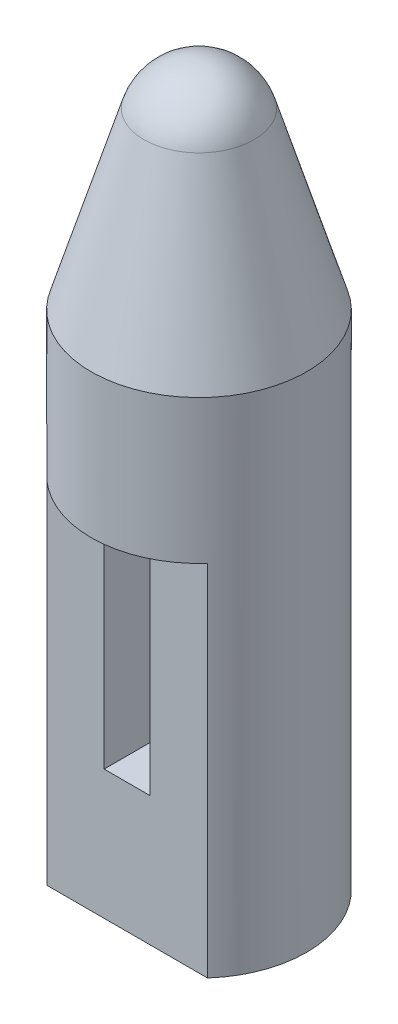
ISO-10303-21;
HEADER;
FILE_DESCRIPTION(('STEP AP214'),'2;1');
FILE_NAME('part.step','',(''),(''),'','','');
FILE_SCHEMA(('AUTOMOTIVE_DESIGN { 1 0 10303 214 1 1 1 1 }'));
ENDSEC;
DATA;
#1=APPLICATION_CONTEXT('core data for automotive mechanical design processes');
#2=APPLICATION_PROTOCOL_DEFINITION('international standard','automotive_design',2000,#1);
#3=PRODUCT_CONTEXT('',#1,'mechanical');
#4=PRODUCT('Part','Part','',(#3));
#5=PRODUCT_RELATED_PRODUCT_CATEGORY('part','',(#4));
#6=PRODUCT_DEFINITION_FORMATION('','',#4);
#7=PRODUCT_DEFINITION_CONTEXT('part definition',#1,'design');
#8=PRODUCT_DEFINITION('design','',#6,#7);
#9=PRODUCT_DEFINITION_SHAPE('','',#8);
#10=(LENGTH_UNIT() NAMED_UNIT(*) SI_UNIT(.MILLI.,.METRE.));
#11=(NAMED_UNIT(*) PLANE_ANGLE_UNIT() SI_UNIT($,.RADIAN.));
#12=(NAMED_UNIT(*) SI_UNIT($,.STERADIAN.) SOLID_ANGLE_UNIT());
#13=UNCERTAINTY_MEASURE_WITH_UNIT(LENGTH_MEASURE(1.E-05),#10,'distance_accuracy_value','');
#14=(GEOMETRIC_REPRESENTATION_CONTEXT(3) GLOBAL_UNCERTAINTY_ASSIGNED_CONTEXT((#13)) GLOBAL_UNIT_ASSIGNED_CONTEXT((#10,
#11,#12)) REPRESENTATION_CONTEXT('',''));
#15=CARTESIAN_POINT('',(0.,0.,0.));
#16=DIRECTION('',(0.,0.,1.));
#17=DIRECTION('',(1.,0.,0.));
#18=AXIS2_PLACEMENT_3D('',#15,#16,#17);
#19=CARTESIAN_POINT('',(0.,0.,1.));
#20=DIRECTION('',(0.,0.,-1.));
#21=DIRECTION('',(-1.,0.,0.));
#22=AXIS2_PLACEMENT_3D('',#19,#20,#21);
#23=PLANE('',#22);
#24=CARTESIAN_POINT('',(-16.3402501077831,13.5405133791338,1.));
#25=DIRECTION('',(0.,0.,1.));
#26=DIRECTION('',(1.,0.,0.));
#27=AXIS2_PLACEMENT_3D('',#24,#25,#26);
#28=CIRCLE('',#27,1.6);
#29=CARTESIAN_POINT('',(-14.7402501077831,13.5405133791338,1.));
#30=VERTEX_POINT('',#29);
#31=CARTESIAN_POINT('',(-17.9402501077831,13.5405133791338,1.));
#32=VERTEX_POINT('',#31);
#33=EDGE_CURVE('E49',#30,#32,#28,.T.);
#34=ORIENTED_EDGE('',*,*,#33,.F.);
#35=DIRECTION('',(0.,1.,0.));
#36=VECTOR('',#35,1.);
#37=CARTESIAN_POINT('',(-14.7402501077831,22.5405133791338,1.));
#38=LINE('',#37,#36);
#39=CARTESIAN_POINT('',(-14.7402501077831,22.5405133791338,1.));
#40=VERTEX_POINT('',#39);
#41=EDGE_CURVE('E115',#30,#40,#38,.T.);
#42=ORIENTED_EDGE('',*,*,#41,.T.);
#43=DIRECTION('',(-1.,0.,0.));
#44=VECTOR('',#43,1.);
#45=CARTESIAN_POINT('',(-14.7402501077831,22.5405133791338,1.));
#46=LINE('',#45,#44);
#47=CARTESIAN_POINT('',(-17.9402501077831,22.5405133791338,1.));
#48=VERTEX_POINT('',#47);
#49=EDGE_CURVE('E128',#40,#48,#46,.T.);
#50=ORIENTED_EDGE('',*,*,#49,.T.);
#51=DIRECTION('',(0.,-1.,0.));
#52=VECTOR('',#51,1.);
#53=CARTESIAN_POINT('',(-17.9402501077831,22.5405133791338,1.));
#54=LINE('',#53,#52);
#55=EDGE_CURVE('E117',#48,#32,#54,.T.);
#56=ORIENTED_EDGE('',*,*,#55,.T.);
#57=EDGE_LOOP('',(#34,#42,#50,#56));
#58=FACE_BOUND('',#57,.T.);
#59=ADVANCED_FACE('F34',(#58),#23,.F.);
#60=CARTESIAN_POINT('',(-16.3402501077831,43.5405133791338,0.));
#61=DIRECTION('',(0.,1.,0.));
#62=DIRECTION('',(1.,0.,0.));
#63=AXIS2_PLACEMENT_3D('',#60,#61,#62);
#64=SPHERICAL_SURFACE('',#63,4.);
#65=CARTESIAN_POINT('',(-16.3402501077831,44.6968053564314,0.));
#66=DIRECTION('',(0.,1.,0.));
#67=DIRECTION('',(-1.,0.,0.));
#68=AXIS2_PLACEMENT_3D('',#65,#66,#67);
#69=CIRCLE('',#68,3.82922823336989);
#70=CARTESIAN_POINT('',(-20.169478341153,44.6968053564314,0.));
#71=VERTEX_POINT('',#70);
#72=EDGE_CURVE('E171',#71,#71,#69,.T.);
#73=ORIENTED_EDGE('',*,*,#72,.T.);
#74=EDGE_LOOP('',(#73));
#75=FACE_BOUND('',#74,.T.);
#76=ADVANCED_FACE('F36',(#75),#64,.T.);
#77=CARTESIAN_POINT('',(-16.3402501077831,-2.45948662086624,0.));
#78=DIRECTION('',(0.,1.,0.));
#79=DIRECTION('',(-1.,0.,0.));
#80=AXIS2_PLACEMENT_3D('',#77,#78,#79);
#81=PLANE('',#80);
#82=CARTESIAN_POINT('',(-16.3402501077831,-2.45948662086624,0.));
#83=DIRECTION('',(0.,1.,0.));
#84=DIRECTION('',(-1.,0.,0.));
#85=AXIS2_PLACEMENT_3D('',#82,#83,#84);
#86=CIRCLE('',#85,7.5);
#87=CARTESIAN_POINT('',(-10.7500801640336,-2.45948662086624,5.));
#88=VERTEX_POINT('',#87);
#89=CARTESIAN_POINT('',(-10.7500801640336,-2.45948662086624,-5.));
#90=VERTEX_POINT('',#89);
#91=EDGE_CURVE('E43',#88,#90,#86,.T.);
#92=ORIENTED_EDGE('',*,*,#91,.F.);
#93=DIRECTION('',(1.,0.,0.));
#94=VECTOR('',#93,1.);
#95=CARTESIAN_POINT('',(-21.9304200515326,-2.45948662086624,5.));
#96=LINE('',#95,#94);
#97=CARTESIAN_POINT('',(-21.9304200515326,-2.45948662086624,5.));
#98=VERTEX_POINT('',#97);
#99=EDGE_CURVE('E144',#98,#88,#96,.T.);
#100=ORIENTED_EDGE('',*,*,#99,.F.);
#101=CARTESIAN_POINT('',(-21.9304200515326,-2.45948662086624,-5.));
#102=VERTEX_POINT('',#101);
#103=EDGE_CURVE('E11',#102,#98,#86,.T.);
#104=ORIENTED_EDGE('',*,*,#103,.F.);
#105=DIRECTION('',(-1.,0.,0.));
#106=VECTOR('',#105,1.);
#107=CARTESIAN_POINT('',(-21.9304200515326,-2.45948662086624,-5.));
#108=LINE('',#107,#106);
#109=EDGE_CURVE('E160',#90,#102,#108,.T.);
#110=ORIENTED_EDGE('',*,*,#109,.F.);
#111=EDGE_LOOP('',(#92,#100,#104,#110));
#112=FACE_BOUND('',#111,.T.);
#113=ADVANCED_FACE('F196',(#112),#81,.F.);
#114=CARTESIAN_POINT('',(-16.3402501077831,47.5405133791338,0.));
#115=DIRECTION('',(0.,1.,0.));
#116=DIRECTION('',(-1.,0.,0.));
#117=AXIS2_PLACEMENT_3D('',#114,#115,#116);
#118=CYLINDRICAL_SURFACE('',#117,7.5);
#119=ORIENTED_EDGE('',*,*,#103,.T.);
#120=DIRECTION('',(0.,-1.,0.));
#121=VECTOR('',#120,1.);
#122=CARTESIAN_POINT('',(-21.9304200515326,22.5405133791338,5.));
#123=LINE('',#122,#121);
#124=CARTESIAN_POINT('',(-21.9304200515326,22.5405133791338,5.));
#125=VERTEX_POINT('',#124);
#126=EDGE_CURVE('E155',#125,#98,#123,.T.);
#127=ORIENTED_EDGE('',*,*,#126,.F.);
#128=CARTESIAN_POINT('',(-16.3402501077831,22.5405133791338,0.));
#129=DIRECTION('',(0.,-1.,0.));
#130=DIRECTION('',(1.,0.,0.));
#131=AXIS2_PLACEMENT_3D('',#128,#129,#130);
#132=CIRCLE('',#131,7.5);
#133=CARTESIAN_POINT('',(-10.7500801640336,22.5405133791338,5.));
#134=VERTEX_POINT('',#133);
#135=EDGE_CURVE('E149',#134,#125,#132,.T.);
#136=ORIENTED_EDGE('',*,*,#135,.F.);
#137=DIRECTION('',(0.,-1.,0.));
#138=VECTOR('',#137,1.);
#139=CARTESIAN_POINT('',(-10.7500801640336,22.5405133791338,5.));
#140=LINE('',#139,#138);
#141=EDGE_CURVE('E157',#134,#88,#140,.T.);
#142=ORIENTED_EDGE('',*,*,#141,.T.);
#143=ORIENTED_EDGE('',*,*,#91,.T.);
#144=DIRECTION('',(0.,-1.,0.));
#145=VECTOR('',#144,1.);
#146=CARTESIAN_POINT('',(-10.7500801640336,22.5405133791338,-5.));
#147=LINE('',#146,#145);
#148=CARTESIAN_POINT('',(-10.7500801640336,22.5405133791338,-5.));
#149=VERTEX_POINT('',#148);
#150=EDGE_CURVE('E166',#149,#90,#147,.T.);
#151=ORIENTED_EDGE('',*,*,#150,.F.);
#152=CARTESIAN_POINT('',(-16.3402501077831,22.5405133791338,0.));
#153=DIRECTION('',(0.,-1.,0.));
#154=DIRECTION('',(1.,0.,0.));
#155=AXIS2_PLACEMENT_3D('',#152,#153,#154);
#156=CIRCLE('',#155,7.5);
#157=CARTESIAN_POINT('',(-21.9304200515326,22.5405133791338,-5.));
#158=VERTEX_POINT('',#157);
#159=EDGE_CURVE('E162',#158,#149,#156,.T.);
#160=ORIENTED_EDGE('',*,*,#159,.F.);
#161=DIRECTION('',(0.,-1.,0.));
#162=VECTOR('',#161,1.);
#163=CARTESIAN_POINT('',(-21.9304200515326,22.5405133791338,-5.));
#164=LINE('',#163,#162);
#165=EDGE_CURVE('E168',#158,#102,#164,.T.);
#166=ORIENTED_EDGE('',*,*,#165,.T.);
#167=EDGE_LOOP('',(#119,#127,#136,#142,#143,#151,#160,#166));
#168=FACE_BOUND('',#167,.T.);
#169=CARTESIAN_POINT('',(-16.3402501077831,32.5405133791338,0.));
#170=DIRECTION('',(0.,1.,0.));
#171=DIRECTION('',(-1.,0.,0.));
#172=AXIS2_PLACEMENT_3D('',#169,#170,#171);
#173=CIRCLE('',#172,7.50000000000001);
#174=CARTESIAN_POINT('',(-23.8402501077831,32.5405133791338,0.));
#175=VERTEX_POINT('',#174);
#176=EDGE_CURVE('E176',#175,#175,#173,.T.);
#177=ORIENTED_EDGE('',*,*,#176,.F.);
#178=EDGE_LOOP('',(#177));
#179=FACE_BOUND('',#178,.T.);
#180=ADVANCED_FACE('F183',(#168,#179),#118,.T.);
#181=CARTESIAN_POINT('',(-16.3402501077831,32.5405133791338,0.));
#182=DIRECTION('',(0.,-1.,0.));
#183=DIRECTION('',(1.,0.,0.));
#184=AXIS2_PLACEMENT_3D('',#181,#182,#183);
#185=CONICAL_SURFACE('',#184,7.5,0.293258348711447);
#186=ORIENTED_EDGE('',*,*,#72,.F.);
#187=EDGE_LOOP('',(#186));
#188=FACE_BOUND('',#187,.T.);
#189=ORIENTED_EDGE('',*,*,#176,.T.);
#190=EDGE_LOOP('',(#189));
#191=FACE_BOUND('',#190,.T.);
#192=ADVANCED_FACE('F210',(#188,#191),#185,.T.);
#193=CARTESIAN_POINT('',(-21.9304200515326,22.5405133791338,-5.));
#194=DIRECTION('',(0.,0.,1.));
#195=DIRECTION('',(1.,0.,0.));
#196=AXIS2_PLACEMENT_3D('',#193,#194,#195);
#197=PLANE('',#196);
#198=CARTESIAN_POINT('',(-16.3402501077831,13.5405133791338,-5.));
#199=DIRECTION('',(0.,0.,1.));
#200=DIRECTION('',(1.,0.,0.));
#201=AXIS2_PLACEMENT_3D('',#198,#199,#200);
#202=CIRCLE('',#201,1.6);
#203=CARTESIAN_POINT('',(-14.7402501077831,13.5405133791338,-5.));
#204=VERTEX_POINT('',#203);
#205=EDGE_CURVE('E38',#204,#204,#202,.T.);
#206=ORIENTED_EDGE('',*,*,#205,.T.);
#207=EDGE_LOOP('',(#206));
#208=FACE_BOUND('',#207,.T.);
#209=ORIENTED_EDGE('',*,*,#109,.T.);
#210=ORIENTED_EDGE('',*,*,#165,.F.);
#211=DIRECTION('',(-1.,0.,0.));
#212=VECTOR('',#211,1.);
#213=CARTESIAN_POINT('',(-21.9304200515326,22.5405133791338,-5.));
#214=LINE('',#213,#212);
#215=EDGE_CURVE('E164',#149,#158,#214,.T.);
#216=ORIENTED_EDGE('',*,*,#215,.F.);
#217=ORIENTED_EDGE('',*,*,#150,.T.);
#218=EDGE_LOOP('',(#209,#210,#216,#217));
#219=FACE_BOUND('',#218,.T.);
#220=ADVANCED_FACE('F193',(#208,#219),#197,.F.);
#221=CARTESIAN_POINT('',(-16.3402501077831,22.5405133791338,0.));
#222=DIRECTION('',(0.,-1.,0.));
#223=DIRECTION('',(1.,0.,0.));
#224=AXIS2_PLACEMENT_3D('',#221,#222,#223);
#225=PLANE('',#224);
#226=ORIENTED_EDGE('',*,*,#159,.T.);
#227=ORIENTED_EDGE('',*,*,#215,.T.);
#228=EDGE_LOOP('',(#226,#227));
#229=FACE_BOUND('',#228,.T.);
#230=ADVANCED_FACE('F199',(#229),#225,.T.);
#231=CARTESIAN_POINT('',(-21.9304200515326,22.5405133791338,5.));
#232=DIRECTION('',(0.,0.,-1.));
#233=DIRECTION('',(-1.,0.,0.));
#234=AXIS2_PLACEMENT_3D('',#231,#232,#233);
#235=PLANE('',#234);
#236=DIRECTION('',(1.,0.,0.));
#237=VECTOR('',#236,1.);
#238=CARTESIAN_POINT('',(-14.7402501077831,6.54051337913376,5.));
#239=LINE('',#238,#237);
#240=CARTESIAN_POINT('',(-17.9402501077831,6.54051337913376,5.));
#241=VERTEX_POINT('',#240);
#242=CARTESIAN_POINT('',(-14.7402501077831,6.54051337913376,5.));
#243=VERTEX_POINT('',#242);
#244=EDGE_CURVE('E137',#241,#243,#239,.T.);
#245=ORIENTED_EDGE('',*,*,#244,.F.);
#246=DIRECTION('',(0.,-1.,0.));
#247=VECTOR('',#246,1.);
#248=CARTESIAN_POINT('',(-17.9402501077831,22.5405133791338,5.));
#249=LINE('',#248,#247);
#250=CARTESIAN_POINT('',(-17.9402501077831,22.5405133791338,5.));
#251=VERTEX_POINT('',#250);
#252=EDGE_CURVE('E134',#251,#241,#249,.T.);
#253=ORIENTED_EDGE('',*,*,#252,.F.);
#254=DIRECTION('',(1.,0.,0.));
#255=VECTOR('',#254,1.);
#256=CARTESIAN_POINT('',(-21.9304200515326,22.5405133791338,5.));
#257=LINE('',#256,#255);
#258=EDGE_CURVE('E152',#125,#251,#257,.T.);
#259=ORIENTED_EDGE('',*,*,#258,.F.);
#260=ORIENTED_EDGE('',*,*,#126,.T.);
#261=ORIENTED_EDGE('',*,*,#99,.T.);
#262=ORIENTED_EDGE('',*,*,#141,.F.);
#263=CARTESIAN_POINT('',(-14.7402501077831,22.5405133791338,5.));
#264=VERTEX_POINT('',#263);
#265=EDGE_CURVE('E151',#264,#134,#257,.T.);
#266=ORIENTED_EDGE('',*,*,#265,.F.);
#267=DIRECTION('',(0.,1.,0.));
#268=VECTOR('',#267,1.);
#269=CARTESIAN_POINT('',(-14.7402501077831,22.5405133791338,5.));
#270=LINE('',#269,#268);
#271=EDGE_CURVE('E57',#243,#264,#270,.T.);
#272=ORIENTED_EDGE('',*,*,#271,.F.);
#273=EDGE_LOOP('',(#245,#253,#259,#260,#261,#262,#266,#272));
#274=FACE_BOUND('',#273,.T.);
#275=ADVANCED_FACE('F201',(#274),#235,.F.);
#276=CARTESIAN_POINT('',(-16.3402501077831,22.5405133791338,0.));
#277=DIRECTION('',(0.,-1.,0.));
#278=DIRECTION('',(1.,0.,0.));
#279=AXIS2_PLACEMENT_3D('',#276,#277,#278);
#280=PLANE('',#279);
#281=ORIENTED_EDGE('',*,*,#135,.T.);
#282=ORIENTED_EDGE('',*,*,#258,.T.);
#283=DIRECTION('',(0.,0.,1.));
#284=VECTOR('',#283,1.);
#285=CARTESIAN_POINT('',(-17.9402501077831,22.5405133791338,1.));
#286=LINE('',#285,#284);
#287=EDGE_CURVE('E142',#48,#251,#286,.T.);
#288=ORIENTED_EDGE('',*,*,#287,.F.);
#289=ORIENTED_EDGE('',*,*,#49,.F.);
#290=DIRECTION('',(0.,0.,1.));
#291=VECTOR('',#290,1.);
#292=CARTESIAN_POINT('',(-14.7402501077831,22.5405133791338,1.));
#293=LINE('',#292,#291);
#294=EDGE_CURVE('E122',#40,#264,#293,.T.);
#295=ORIENTED_EDGE('',*,*,#294,.T.);
#296=ORIENTED_EDGE('',*,*,#265,.T.);
#297=EDGE_LOOP('',(#281,#282,#288,#289,#295,#296));
#298=FACE_BOUND('',#297,.T.);
#299=ADVANCED_FACE('F207',(#298),#280,.T.);
#300=CARTESIAN_POINT('',(-17.9402501077831,22.5405133791338,1.));
#301=DIRECTION('',(-1.,0.,0.));
#302=DIRECTION('',(0.,-1.,0.));
#303=AXIS2_PLACEMENT_3D('',#300,#301,#302);
#304=PLANE('',#303);
#305=ORIENTED_EDGE('',*,*,#252,.T.);
#306=DIRECTION('',(0.,0.,1.));
#307=VECTOR('',#306,1.);
#308=CARTESIAN_POINT('',(-17.9402501077831,6.54051337913376,1.));
#309=LINE('',#308,#307);
#310=CARTESIAN_POINT('',(-17.9402501077831,6.54051337913376,1.));
#311=VERTEX_POINT('',#310);
#312=EDGE_CURVE('E129',#311,#241,#309,.T.);
#313=ORIENTED_EDGE('',*,*,#312,.F.);
#314=EDGE_CURVE('E141',#32,#311,#54,.T.);
#315=ORIENTED_EDGE('',*,*,#314,.F.);
#316=ORIENTED_EDGE('',*,*,#55,.F.);
#317=ORIENTED_EDGE('',*,*,#287,.T.);
#318=EDGE_LOOP('',(#305,#313,#315,#316,#317));
#319=FACE_BOUND('',#318,.T.);
#320=ADVANCED_FACE('F232',(#319),#304,.F.);
#321=CARTESIAN_POINT('',(-14.7402501077831,22.5405133791338,1.));
#322=DIRECTION('',(1.,0.,0.));
#323=DIRECTION('',(0.,0.,-1.));
#324=AXIS2_PLACEMENT_3D('',#321,#322,#323);
#325=PLANE('',#324);
#326=ORIENTED_EDGE('',*,*,#271,.T.);
#327=ORIENTED_EDGE('',*,*,#294,.F.);
#328=ORIENTED_EDGE('',*,*,#41,.F.);
#329=CARTESIAN_POINT('',(-14.7402501077831,6.54051337913376,1.));
#330=VERTEX_POINT('',#329);
#331=EDGE_CURVE('E120',#330,#30,#38,.T.);
#332=ORIENTED_EDGE('',*,*,#331,.F.);
#333=DIRECTION('',(0.,0.,1.));
#334=VECTOR('',#333,1.);
#335=CARTESIAN_POINT('',(-14.7402501077831,6.54051337913376,1.));
#336=LINE('',#335,#334);
#337=EDGE_CURVE('E146',#330,#243,#336,.T.);
#338=ORIENTED_EDGE('',*,*,#337,.T.);
#339=EDGE_LOOP('',(#326,#327,#328,#332,#338));
#340=FACE_BOUND('',#339,.T.);
#341=ADVANCED_FACE('F119',(#340),#325,.F.);
#342=CARTESIAN_POINT('',(-14.7402501077831,6.54051337913376,1.));
#343=DIRECTION('',(0.,-1.,0.));
#344=DIRECTION('',(0.,0.,-1.));
#345=AXIS2_PLACEMENT_3D('',#342,#343,#344);
#346=PLANE('',#345);
#347=ORIENTED_EDGE('',*,*,#244,.T.);
#348=ORIENTED_EDGE('',*,*,#337,.F.);
#349=DIRECTION('',(1.,0.,0.));
#350=VECTOR('',#349,1.);
#351=CARTESIAN_POINT('',(-14.7402501077831,6.54051337913376,1.));
#352=LINE('',#351,#350);
#353=EDGE_CURVE('E124',#311,#330,#352,.T.);
#354=ORIENTED_EDGE('',*,*,#353,.F.);
#355=ORIENTED_EDGE('',*,*,#312,.T.);
#356=EDGE_LOOP('',(#347,#348,#354,#355));
#357=FACE_BOUND('',#356,.T.);
#358=ADVANCED_FACE('F222',(#357),#346,.F.);
#359=EDGE_CURVE('E104',#32,#30,#28,.T.);
#360=ORIENTED_EDGE('',*,*,#359,.F.);
#361=ORIENTED_EDGE('',*,*,#314,.T.);
#362=ORIENTED_EDGE('',*,*,#353,.T.);
#363=ORIENTED_EDGE('',*,*,#331,.T.);
#364=EDGE_LOOP('',(#360,#361,#362,#363));
#365=FACE_BOUND('',#364,.T.);
#366=ADVANCED_FACE('F126',(#365),#23,.F.);
#367=CARTESIAN_POINT('',(-16.3402501077831,13.5405133791338,-9.));
#368=DIRECTION('',(0.,0.,1.));
#369=DIRECTION('',(1.,0.,0.));
#370=AXIS2_PLACEMENT_3D('',#367,#368,#369);
#371=CYLINDRICAL_SURFACE('',#370,1.6);
#372=ORIENTED_EDGE('',*,*,#33,.T.);
#373=ORIENTED_EDGE('',*,*,#359,.T.);
#374=EDGE_LOOP('',(#372,#373));
#375=FACE_BOUND('',#374,.T.);
#376=ORIENTED_EDGE('',*,*,#205,.F.);
#377=EDGE_LOOP('',(#376));
#378=FACE_BOUND('',#377,.T.);
#379=ADVANCED_FACE('F105',(#375,#378),#371,.F.);
#380=CLOSED_SHELL('',(#59,#76,#113,#180,#192,#220,#230,#275,#299,#320,#341,#358,#366,#379));
#381=MANIFOLD_SOLID_BREP('B2',#380);
#382=ADVANCED_BREP_SHAPE_REPRESENTATION('',(#18,#381),#14);
#383=SHAPE_DEFINITION_REPRESENTATION(#9,#382);
ENDSEC;
END-ISO-10303-21;
